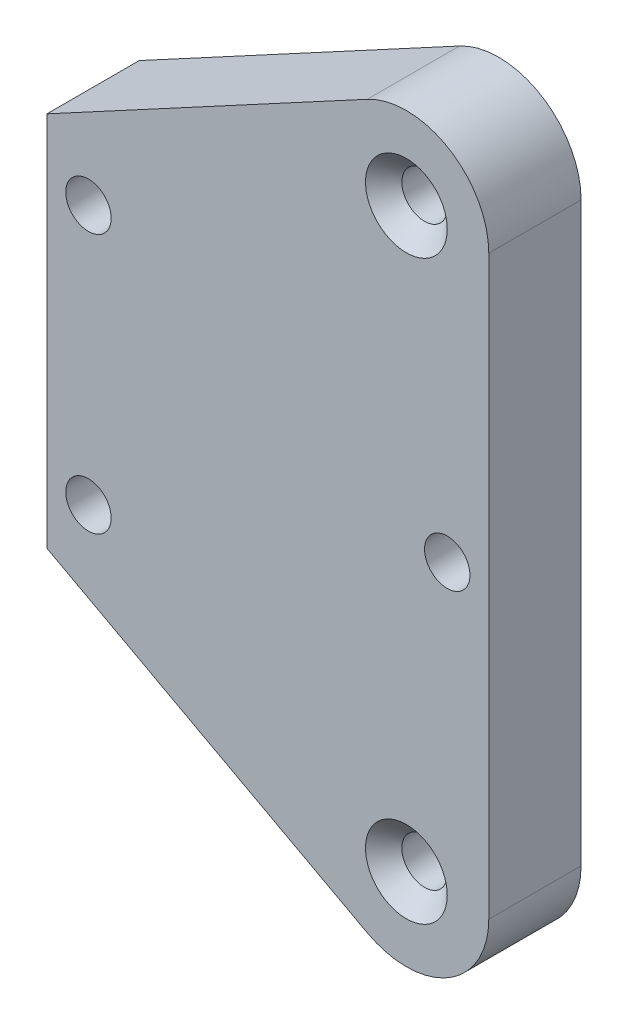
ISO-10303-21;
HEADER;
FILE_DESCRIPTION(('STEP AP214'),'2;1');
FILE_NAME('part.step','',(''),(''),'','','');
FILE_SCHEMA(('AUTOMOTIVE_DESIGN { 1 0 10303 214 1 1 1 1 }'));
ENDSEC;
DATA;
#1=APPLICATION_CONTEXT('core data for automotive mechanical design processes');
#2=APPLICATION_PROTOCOL_DEFINITION('international standard','automotive_design',2000,#1);
#3=PRODUCT_CONTEXT('',#1,'mechanical');
#4=PRODUCT('Part','Part','',(#3));
#5=PRODUCT_RELATED_PRODUCT_CATEGORY('part','',(#4));
#6=PRODUCT_DEFINITION_FORMATION('','',#4);
#7=PRODUCT_DEFINITION_CONTEXT('part definition',#1,'design');
#8=PRODUCT_DEFINITION('design','',#6,#7);
#9=PRODUCT_DEFINITION_SHAPE('','',#8);
#10=(LENGTH_UNIT() NAMED_UNIT(*) SI_UNIT(.MILLI.,.METRE.));
#11=(NAMED_UNIT(*) PLANE_ANGLE_UNIT() SI_UNIT($,.RADIAN.));
#12=(NAMED_UNIT(*) SI_UNIT($,.STERADIAN.) SOLID_ANGLE_UNIT());
#13=UNCERTAINTY_MEASURE_WITH_UNIT(LENGTH_MEASURE(1.E-05),#10,'distance_accuracy_value','');
#14=(GEOMETRIC_REPRESENTATION_CONTEXT(3) GLOBAL_UNCERTAINTY_ASSIGNED_CONTEXT((#13)) GLOBAL_UNIT_ASSIGNED_CONTEXT((#10,
#11,#12)) REPRESENTATION_CONTEXT('',''));
#15=CARTESIAN_POINT('',(0.,0.,0.));
#16=DIRECTION('',(0.,0.,1.));
#17=DIRECTION('',(1.,0.,0.));
#18=AXIS2_PLACEMENT_3D('',#15,#16,#17);
#19=CARTESIAN_POINT('',(0.,22.225,7.112));
#20=DIRECTION('',(0.,0.,-1.));
#21=DIRECTION('',(-1.,0.,0.));
#22=AXIS2_PLACEMENT_3D('',#19,#20,#21);
#23=PLANE('',#22);
#24=CARTESIAN_POINT('',(0.,22.225,7.112));
#25=DIRECTION('',(0.,0.,1.));
#26=DIRECTION('',(1.,0.,0.));
#27=AXIS2_PLACEMENT_3D('',#24,#25,#26);
#28=CIRCLE('',#27,3.15);
#29=CARTESIAN_POINT('',(3.15000000000001,22.225,7.112));
#30=VERTEX_POINT('',#29);
#31=EDGE_CURVE('E251',#30,#30,#28,.T.);
#32=ORIENTED_EDGE('',*,*,#31,.F.);
#33=EDGE_LOOP('',(#32));
#34=FACE_BOUND('',#33,.T.);
#35=CARTESIAN_POINT('',(3.15,0.,7.112));
#36=DIRECTION('',(0.,0.,1.));
#37=DIRECTION('',(1.,0.,0.));
#38=AXIS2_PLACEMENT_3D('',#35,#36,#37);
#39=CIRCLE('',#38,1.75);
#40=CARTESIAN_POINT('',(4.9,0.,7.112));
#41=VERTEX_POINT('',#40);
#42=EDGE_CURVE('E139',#41,#41,#39,.T.);
#43=ORIENTED_EDGE('',*,*,#42,.F.);
#44=EDGE_LOOP('',(#43));
#45=FACE_BOUND('',#44,.T.);
#46=CARTESIAN_POINT('',(-24.5,-10.,7.112));
#47=DIRECTION('',(0.,0.,1.));
#48=DIRECTION('',(1.,0.,0.));
#49=AXIS2_PLACEMENT_3D('',#46,#47,#48);
#50=CIRCLE('',#49,1.75);
#51=CARTESIAN_POINT('',(-22.75,-10.,7.112));
#52=VERTEX_POINT('',#51);
#53=EDGE_CURVE('E165',#52,#52,#50,.T.);
#54=ORIENTED_EDGE('',*,*,#53,.F.);
#55=EDGE_LOOP('',(#54));
#56=FACE_BOUND('',#55,.T.);
#57=CARTESIAN_POINT('',(-24.5,9.99999999999999,7.112));
#58=DIRECTION('',(0.,0.,1.));
#59=DIRECTION('',(1.,0.,0.));
#60=AXIS2_PLACEMENT_3D('',#57,#58,#59);
#61=CIRCLE('',#60,1.75);
#62=CARTESIAN_POINT('',(-22.75,9.99999999999999,7.112));
#63=VERTEX_POINT('',#62);
#64=EDGE_CURVE('E168',#63,#63,#61,.T.);
#65=ORIENTED_EDGE('',*,*,#64,.F.);
#66=EDGE_LOOP('',(#65));
#67=FACE_BOUND('',#66,.T.);
#68=DIRECTION('',(-0.880148498110485,-0.474698452992906,0.));
#69=VECTOR('',#68,1.);
#70=CARTESIAN_POINT('',(-27.7,14.5,7.112));
#71=LINE('',#70,#69);
#72=CARTESIAN_POINT('',(-3.01433517650495,27.8139429630016,7.112));
#73=VERTEX_POINT('',#72);
#74=CARTESIAN_POINT('',(-27.7,14.5,7.112));
#75=VERTEX_POINT('',#74);
#76=EDGE_CURVE('E131',#73,#75,#71,.T.);
#77=ORIENTED_EDGE('',*,*,#76,.T.);
#78=DIRECTION('',(0.,-1.,0.));
#79=VECTOR('',#78,1.);
#80=CARTESIAN_POINT('',(-27.7,14.5,7.112));
#81=LINE('',#80,#79);
#82=CARTESIAN_POINT('',(-27.7,-14.5,7.112));
#83=VERTEX_POINT('',#82);
#84=EDGE_CURVE('E89',#75,#83,#81,.T.);
#85=ORIENTED_EDGE('',*,*,#84,.T.);
#86=DIRECTION('',(0.880148498110485,-0.474698452992906,0.));
#87=VECTOR('',#86,1.);
#88=CARTESIAN_POINT('',(-27.7,-14.5,7.112));
#89=LINE('',#88,#87);
#90=CARTESIAN_POINT('',(-3.01433517650494,-27.8139429630016,7.112));
#91=VERTEX_POINT('',#90);
#92=EDGE_CURVE('E102',#83,#91,#89,.T.);
#93=ORIENTED_EDGE('',*,*,#92,.T.);
#94=CARTESIAN_POINT('',(0.,-22.225,7.112));
#95=DIRECTION('',(0.,0.,1.));
#96=DIRECTION('',(1.,0.,0.));
#97=AXIS2_PLACEMENT_3D('',#94,#95,#96);
#98=CIRCLE('',#97,6.35);
#99=CARTESIAN_POINT('',(6.35000000000001,-22.225,7.112));
#100=VERTEX_POINT('',#99);
#101=EDGE_CURVE('E96',#91,#100,#98,.T.);
#102=ORIENTED_EDGE('',*,*,#101,.T.);
#103=DIRECTION('',(0.,1.,0.));
#104=VECTOR('',#103,1.);
#105=CARTESIAN_POINT('',(6.35,22.225,7.112));
#106=LINE('',#105,#104);
#107=CARTESIAN_POINT('',(6.35,22.225,7.112));
#108=VERTEX_POINT('',#107);
#109=EDGE_CURVE('E100',#100,#108,#106,.T.);
#110=ORIENTED_EDGE('',*,*,#109,.T.);
#111=CARTESIAN_POINT('',(0.,22.225,7.112));
#112=DIRECTION('',(0.,0.,1.));
#113=DIRECTION('',(-1.,0.,0.));
#114=AXIS2_PLACEMENT_3D('',#111,#112,#113);
#115=CIRCLE('',#114,6.35);
#116=EDGE_CURVE('E52',#108,#73,#115,.T.);
#117=ORIENTED_EDGE('',*,*,#116,.T.);
#118=EDGE_LOOP('',(#77,#85,#93,#102,#110,#117));
#119=FACE_BOUND('',#118,.T.);
#120=CARTESIAN_POINT('',(0.,-22.225,7.112));
#121=DIRECTION('',(0.,0.,1.));
#122=DIRECTION('',(1.,0.,0.));
#123=AXIS2_PLACEMENT_3D('',#120,#121,#122);
#124=CIRCLE('',#123,3.15);
#125=CARTESIAN_POINT('',(3.15000000000001,-22.225,7.112));
#126=VERTEX_POINT('',#125);
#127=EDGE_CURVE('E155',#126,#126,#124,.T.);
#128=ORIENTED_EDGE('',*,*,#127,.F.);
#129=EDGE_LOOP('',(#128));
#130=FACE_BOUND('',#129,.T.);
#131=ADVANCED_FACE('F33',(#34,#45,#56,#67,#119,#130),#23,.F.);
#132=CARTESIAN_POINT('',(0.,22.225,0.));
#133=DIRECTION('',(0.,0.,-1.));
#134=DIRECTION('',(-1.,0.,0.));
#135=AXIS2_PLACEMENT_3D('',#132,#133,#134);
#136=PLANE('',#135);
#137=CARTESIAN_POINT('',(3.15,0.,0.));
#138=DIRECTION('',(0.,0.,-1.));
#139=DIRECTION('',(-1.,0.,0.));
#140=AXIS2_PLACEMENT_3D('',#137,#138,#139);
#141=CIRCLE('',#140,3.15);
#142=CARTESIAN_POINT('',(0.,0.,0.));
#143=VERTEX_POINT('',#142);
#144=EDGE_CURVE('E144',#143,#143,#141,.T.);
#145=ORIENTED_EDGE('',*,*,#144,.F.);
#146=EDGE_LOOP('',(#145));
#147=FACE_BOUND('',#146,.T.);
#148=CARTESIAN_POINT('',(-24.5,9.99999999999999,0.));
#149=DIRECTION('',(0.,0.,-1.));
#150=DIRECTION('',(-1.,0.,0.));
#151=AXIS2_PLACEMENT_3D('',#148,#149,#150);
#152=CIRCLE('',#151,3.15);
#153=CARTESIAN_POINT('',(-27.65,9.99999999999999,0.));
#154=VERTEX_POINT('',#153);
#155=EDGE_CURVE('E143',#154,#154,#152,.T.);
#156=ORIENTED_EDGE('',*,*,#155,.F.);
#157=EDGE_LOOP('',(#156));
#158=FACE_BOUND('',#157,.T.);
#159=CARTESIAN_POINT('',(-24.5,-10.,0.));
#160=DIRECTION('',(0.,0.,-1.));
#161=DIRECTION('',(-1.,0.,0.));
#162=AXIS2_PLACEMENT_3D('',#159,#160,#161);
#163=CIRCLE('',#162,3.15);
#164=CARTESIAN_POINT('',(-27.65,-10.,0.));
#165=VERTEX_POINT('',#164);
#166=EDGE_CURVE('E140',#165,#165,#163,.T.);
#167=ORIENTED_EDGE('',*,*,#166,.F.);
#168=EDGE_LOOP('',(#167));
#169=FACE_BOUND('',#168,.T.);
#170=CARTESIAN_POINT('',(0.,22.225,0.));
#171=DIRECTION('',(0.,0.,1.));
#172=DIRECTION('',(1.,0.,0.));
#173=AXIS2_PLACEMENT_3D('',#170,#171,#172);
#174=CIRCLE('',#173,1.75);
#175=CARTESIAN_POINT('',(1.75000000000001,22.225,0.));
#176=VERTEX_POINT('',#175);
#177=EDGE_CURVE('E171',#176,#176,#174,.T.);
#178=ORIENTED_EDGE('',*,*,#177,.T.);
#179=EDGE_LOOP('',(#178));
#180=FACE_BOUND('',#179,.T.);
#181=DIRECTION('',(-0.880148498110485,-0.474698452992906,0.));
#182=VECTOR('',#181,1.);
#183=CARTESIAN_POINT('',(-27.7,14.5,0.));
#184=LINE('',#183,#182);
#185=CARTESIAN_POINT('',(-3.01433517650495,27.8139429630016,0.));
#186=VERTEX_POINT('',#185);
#187=CARTESIAN_POINT('',(-27.7,14.5,0.));
#188=VERTEX_POINT('',#187);
#189=EDGE_CURVE('E120',#186,#188,#184,.T.);
#190=ORIENTED_EDGE('',*,*,#189,.F.);
#191=CARTESIAN_POINT('',(0.,22.225,0.));
#192=DIRECTION('',(0.,0.,1.));
#193=DIRECTION('',(-1.,0.,0.));
#194=AXIS2_PLACEMENT_3D('',#191,#192,#193);
#195=CIRCLE('',#194,6.35);
#196=CARTESIAN_POINT('',(6.35,22.225,0.));
#197=VERTEX_POINT('',#196);
#198=EDGE_CURVE('E81',#197,#186,#195,.T.);
#199=ORIENTED_EDGE('',*,*,#198,.F.);
#200=DIRECTION('',(0.,1.,0.));
#201=VECTOR('',#200,1.);
#202=CARTESIAN_POINT('',(6.35,22.225,0.));
#203=LINE('',#202,#201);
#204=CARTESIAN_POINT('',(6.35000000000001,-22.225,0.));
#205=VERTEX_POINT('',#204);
#206=EDGE_CURVE('E75',#205,#197,#203,.T.);
#207=ORIENTED_EDGE('',*,*,#206,.F.);
#208=CARTESIAN_POINT('',(0.,-22.225,0.));
#209=DIRECTION('',(0.,0.,1.));
#210=DIRECTION('',(1.,0.,0.));
#211=AXIS2_PLACEMENT_3D('',#208,#209,#210);
#212=CIRCLE('',#211,6.35);
#213=CARTESIAN_POINT('',(-3.01433517650494,-27.8139429630016,0.));
#214=VERTEX_POINT('',#213);
#215=EDGE_CURVE('E110',#214,#205,#212,.T.);
#216=ORIENTED_EDGE('',*,*,#215,.F.);
#217=DIRECTION('',(0.880148498110485,-0.474698452992906,0.));
#218=VECTOR('',#217,1.);
#219=CARTESIAN_POINT('',(-27.7,-14.5,0.));
#220=LINE('',#219,#218);
#221=CARTESIAN_POINT('',(-27.7,-14.5,0.));
#222=VERTEX_POINT('',#221);
#223=EDGE_CURVE('E126',#222,#214,#220,.T.);
#224=ORIENTED_EDGE('',*,*,#223,.F.);
#225=DIRECTION('',(0.,-1.,0.));
#226=VECTOR('',#225,1.);
#227=CARTESIAN_POINT('',(-27.7,14.5,0.));
#228=LINE('',#227,#226);
#229=EDGE_CURVE('E123',#188,#222,#228,.T.);
#230=ORIENTED_EDGE('',*,*,#229,.F.);
#231=EDGE_LOOP('',(#190,#199,#207,#216,#224,#230));
#232=FACE_BOUND('',#231,.T.);
#233=CARTESIAN_POINT('',(0.,-22.225,0.));
#234=DIRECTION('',(0.,0.,1.));
#235=DIRECTION('',(1.,0.,0.));
#236=AXIS2_PLACEMENT_3D('',#233,#234,#235);
#237=CIRCLE('',#236,1.75);
#238=CARTESIAN_POINT('',(1.75000000000001,-22.225,0.));
#239=VERTEX_POINT('',#238);
#240=EDGE_CURVE('E124',#239,#239,#237,.T.);
#241=ORIENTED_EDGE('',*,*,#240,.T.);
#242=EDGE_LOOP('',(#241));
#243=FACE_BOUND('',#242,.T.);
#244=ADVANCED_FACE('F185',(#147,#158,#169,#180,#232,#243),#136,.T.);
#245=CARTESIAN_POINT('',(-27.7,14.5,7.112));
#246=DIRECTION('',(0.474698452992906,-0.880148498110485,0.));
#247=DIRECTION('',(0.880148498110485,0.474698452992906,0.));
#248=AXIS2_PLACEMENT_3D('',#245,#246,#247);
#249=PLANE('',#248);
#250=ORIENTED_EDGE('',*,*,#189,.T.);
#251=DIRECTION('',(0.,0.,-1.));
#252=VECTOR('',#251,1.);
#253=CARTESIAN_POINT('',(-27.7,14.5,7.112));
#254=LINE('',#253,#252);
#255=EDGE_CURVE('E11',#75,#188,#254,.T.);
#256=ORIENTED_EDGE('',*,*,#255,.F.);
#257=ORIENTED_EDGE('',*,*,#76,.F.);
#258=DIRECTION('',(0.,0.,-1.));
#259=VECTOR('',#258,1.);
#260=CARTESIAN_POINT('',(-3.01433517650495,27.8139429630016,7.112));
#261=LINE('',#260,#259);
#262=EDGE_CURVE('E116',#73,#186,#261,.T.);
#263=ORIENTED_EDGE('',*,*,#262,.T.);
#264=EDGE_LOOP('',(#250,#256,#257,#263));
#265=FACE_BOUND('',#264,.T.);
#266=ADVANCED_FACE('F35',(#265),#249,.F.);
#267=CARTESIAN_POINT('',(-27.7,14.5,7.112));
#268=DIRECTION('',(1.,0.,0.));
#269=DIRECTION('',(0.,0.,-1.));
#270=AXIS2_PLACEMENT_3D('',#267,#268,#269);
#271=PLANE('',#270);
#272=ORIENTED_EDGE('',*,*,#229,.T.);
#273=DIRECTION('',(0.,0.,-1.));
#274=VECTOR('',#273,1.);
#275=CARTESIAN_POINT('',(-27.7,-14.5,7.112));
#276=LINE('',#275,#274);
#277=EDGE_CURVE('E43',#83,#222,#276,.T.);
#278=ORIENTED_EDGE('',*,*,#277,.F.);
#279=ORIENTED_EDGE('',*,*,#84,.F.);
#280=ORIENTED_EDGE('',*,*,#255,.T.);
#281=EDGE_LOOP('',(#272,#278,#279,#280));
#282=FACE_BOUND('',#281,.T.);
#283=ADVANCED_FACE('F179',(#282),#271,.F.);
#284=CARTESIAN_POINT('',(-27.7,-14.5,7.112));
#285=DIRECTION('',(0.474698452992906,0.880148498110485,0.));
#286=DIRECTION('',(-0.880148498110485,0.474698452992906,0.));
#287=AXIS2_PLACEMENT_3D('',#284,#285,#286);
#288=PLANE('',#287);
#289=ORIENTED_EDGE('',*,*,#223,.T.);
#290=DIRECTION('',(0.,0.,-1.));
#291=VECTOR('',#290,1.);
#292=CARTESIAN_POINT('',(-3.01433517650494,-27.8139429630016,7.112));
#293=LINE('',#292,#291);
#294=EDGE_CURVE('E111',#91,#214,#293,.T.);
#295=ORIENTED_EDGE('',*,*,#294,.F.);
#296=ORIENTED_EDGE('',*,*,#92,.F.);
#297=ORIENTED_EDGE('',*,*,#277,.T.);
#298=EDGE_LOOP('',(#289,#295,#296,#297));
#299=FACE_BOUND('',#298,.T.);
#300=ADVANCED_FACE('F182',(#299),#288,.F.);
#301=CARTESIAN_POINT('',(0.,-22.225,7.112));
#302=DIRECTION('',(0.,0.,-1.));
#303=DIRECTION('',(-1.,0.,0.));
#304=AXIS2_PLACEMENT_3D('',#301,#302,#303);
#305=CYLINDRICAL_SURFACE('',#304,6.35);
#306=ORIENTED_EDGE('',*,*,#215,.T.);
#307=DIRECTION('',(0.,0.,-1.));
#308=VECTOR('',#307,1.);
#309=CARTESIAN_POINT('',(6.35000000000001,-22.225,7.112));
#310=LINE('',#309,#308);
#311=EDGE_CURVE('E107',#100,#205,#310,.T.);
#312=ORIENTED_EDGE('',*,*,#311,.F.);
#313=ORIENTED_EDGE('',*,*,#101,.F.);
#314=ORIENTED_EDGE('',*,*,#294,.T.);
#315=EDGE_LOOP('',(#306,#312,#313,#314));
#316=FACE_BOUND('',#315,.T.);
#317=ADVANCED_FACE('F108',(#316),#305,.T.);
#318=CARTESIAN_POINT('',(6.35,22.225,7.112));
#319=DIRECTION('',(-1.,0.,0.));
#320=DIRECTION('',(0.,0.,1.));
#321=AXIS2_PLACEMENT_3D('',#318,#319,#320);
#322=PLANE('',#321);
#323=ORIENTED_EDGE('',*,*,#206,.T.);
#324=DIRECTION('',(0.,0.,-1.));
#325=VECTOR('',#324,1.);
#326=CARTESIAN_POINT('',(6.35,22.225,7.112));
#327=LINE('',#326,#325);
#328=EDGE_CURVE('E112',#108,#197,#327,.T.);
#329=ORIENTED_EDGE('',*,*,#328,.F.);
#330=ORIENTED_EDGE('',*,*,#109,.F.);
#331=ORIENTED_EDGE('',*,*,#311,.T.);
#332=EDGE_LOOP('',(#323,#329,#330,#331));
#333=FACE_BOUND('',#332,.T.);
#334=ADVANCED_FACE('F114',(#333),#322,.F.);
#335=CARTESIAN_POINT('',(0.,22.225,7.112));
#336=DIRECTION('',(0.,0.,-1.));
#337=DIRECTION('',(-1.,0.,0.));
#338=AXIS2_PLACEMENT_3D('',#335,#336,#337);
#339=CYLINDRICAL_SURFACE('',#338,6.35);
#340=ORIENTED_EDGE('',*,*,#198,.T.);
#341=ORIENTED_EDGE('',*,*,#262,.F.);
#342=ORIENTED_EDGE('',*,*,#116,.F.);
#343=ORIENTED_EDGE('',*,*,#328,.T.);
#344=EDGE_LOOP('',(#340,#341,#342,#343));
#345=FACE_BOUND('',#344,.T.);
#346=ADVANCED_FACE('F188',(#345),#339,.T.);
#347=CARTESIAN_POINT('',(0.,-22.225,7.112));
#348=DIRECTION('',(0.,0.,-1.));
#349=DIRECTION('',(-1.,0.,0.));
#350=AXIS2_PLACEMENT_3D('',#347,#348,#349);
#351=CYLINDRICAL_SURFACE('',#350,1.75);
#352=CARTESIAN_POINT('',(0.,-22.225,5.71200000000002));
#353=DIRECTION('',(0.,0.,1.));
#354=DIRECTION('',(1.,0.,0.));
#355=AXIS2_PLACEMENT_3D('',#352,#353,#354);
#356=CIRCLE('',#355,1.75);
#357=CARTESIAN_POINT('',(1.75000000000001,-22.225,5.71200000000002));
#358=VERTEX_POINT('',#357);
#359=EDGE_CURVE('E37',#358,#358,#356,.F.);
#360=ORIENTED_EDGE('',*,*,#359,.F.);
#361=EDGE_LOOP('',(#360));
#362=FACE_BOUND('',#361,.T.);
#363=ORIENTED_EDGE('',*,*,#240,.F.);
#364=EDGE_LOOP('',(#363));
#365=FACE_BOUND('',#364,.T.);
#366=ADVANCED_FACE('F190',(#362,#365),#351,.F.);
#367=CARTESIAN_POINT('',(0.,22.225,7.112));
#368=DIRECTION('',(0.,0.,-1.));
#369=DIRECTION('',(-1.,0.,0.));
#370=AXIS2_PLACEMENT_3D('',#367,#368,#369);
#371=CYLINDRICAL_SURFACE('',#370,1.75);
#372=CARTESIAN_POINT('',(0.,22.225,5.71200000000002));
#373=DIRECTION('',(0.,0.,1.));
#374=DIRECTION('',(1.,0.,0.));
#375=AXIS2_PLACEMENT_3D('',#372,#373,#374);
#376=CIRCLE('',#375,1.75);
#377=CARTESIAN_POINT('',(1.75000000000001,22.225,5.71200000000002));
#378=VERTEX_POINT('',#377);
#379=EDGE_CURVE('E249',#378,#378,#376,.F.);
#380=ORIENTED_EDGE('',*,*,#379,.F.);
#381=EDGE_LOOP('',(#380));
#382=FACE_BOUND('',#381,.T.);
#383=ORIENTED_EDGE('',*,*,#177,.F.);
#384=EDGE_LOOP('',(#383));
#385=FACE_BOUND('',#384,.T.);
#386=ADVANCED_FACE('F196',(#382,#385),#371,.F.);
#387=CARTESIAN_POINT('',(-24.5,9.99999999999999,7.112));
#388=DIRECTION('',(0.,0.,-1.));
#389=DIRECTION('',(-1.,0.,0.));
#390=AXIS2_PLACEMENT_3D('',#387,#388,#389);
#391=CYLINDRICAL_SURFACE('',#390,1.75);
#392=CARTESIAN_POINT('',(-24.5,9.99999999999999,1.4));
#393=DIRECTION('',(0.,0.,-1.));
#394=DIRECTION('',(-1.,0.,0.));
#395=AXIS2_PLACEMENT_3D('',#392,#393,#394);
#396=CIRCLE('',#395,1.75);
#397=CARTESIAN_POINT('',(-26.25,9.99999999999999,1.4));
#398=VERTEX_POINT('',#397);
#399=EDGE_CURVE('E148',#398,#398,#396,.F.);
#400=ORIENTED_EDGE('',*,*,#399,.F.);
#401=EDGE_LOOP('',(#400));
#402=FACE_BOUND('',#401,.T.);
#403=ORIENTED_EDGE('',*,*,#64,.T.);
#404=EDGE_LOOP('',(#403));
#405=FACE_BOUND('',#404,.T.);
#406=ADVANCED_FACE('F213',(#402,#405),#391,.F.);
#407=CARTESIAN_POINT('',(-24.5,-10.,7.112));
#408=DIRECTION('',(0.,0.,-1.));
#409=DIRECTION('',(-1.,0.,0.));
#410=AXIS2_PLACEMENT_3D('',#407,#408,#409);
#411=CYLINDRICAL_SURFACE('',#410,1.75);
#412=CARTESIAN_POINT('',(-24.5,-10.,1.4));
#413=DIRECTION('',(0.,0.,-1.));
#414=DIRECTION('',(-1.,0.,0.));
#415=AXIS2_PLACEMENT_3D('',#412,#413,#414);
#416=CIRCLE('',#415,1.75);
#417=CARTESIAN_POINT('',(-26.25,-10.,1.4));
#418=VERTEX_POINT('',#417);
#419=EDGE_CURVE('E137',#418,#418,#416,.F.);
#420=ORIENTED_EDGE('',*,*,#419,.F.);
#421=EDGE_LOOP('',(#420));
#422=FACE_BOUND('',#421,.T.);
#423=ORIENTED_EDGE('',*,*,#53,.T.);
#424=EDGE_LOOP('',(#423));
#425=FACE_BOUND('',#424,.T.);
#426=ADVANCED_FACE('F217',(#422,#425),#411,.F.);
#427=CARTESIAN_POINT('',(3.15,0.,7.112));
#428=DIRECTION('',(0.,0.,-1.));
#429=DIRECTION('',(-1.,0.,0.));
#430=AXIS2_PLACEMENT_3D('',#427,#428,#429);
#431=CYLINDRICAL_SURFACE('',#430,1.75);
#432=CARTESIAN_POINT('',(3.15,0.,1.39999999999998));
#433=DIRECTION('',(0.,0.,-1.));
#434=DIRECTION('',(-1.,0.,0.));
#435=AXIS2_PLACEMENT_3D('',#432,#433,#434);
#436=CIRCLE('',#435,1.75);
#437=CARTESIAN_POINT('',(1.4,0.,1.39999999999998));
#438=VERTEX_POINT('',#437);
#439=EDGE_CURVE('E141',#438,#438,#436,.F.);
#440=ORIENTED_EDGE('',*,*,#439,.F.);
#441=EDGE_LOOP('',(#440));
#442=FACE_BOUND('',#441,.T.);
#443=ORIENTED_EDGE('',*,*,#42,.T.);
#444=EDGE_LOOP('',(#443));
#445=FACE_BOUND('',#444,.T.);
#446=ADVANCED_FACE('F221',(#442,#445),#431,.F.);
#447=CARTESIAN_POINT('',(-24.5,-10.,0.));
#448=DIRECTION('',(0.,0.,-1.));
#449=DIRECTION('',(-1.,0.,0.));
#450=AXIS2_PLACEMENT_3D('',#447,#448,#449);
#451=CONICAL_SURFACE('',#450,3.15,0.785398163397448);
#452=ORIENTED_EDGE('',*,*,#419,.T.);
#453=EDGE_LOOP('',(#452));
#454=FACE_BOUND('',#453,.T.);
#455=ORIENTED_EDGE('',*,*,#166,.T.);
#456=EDGE_LOOP('',(#455));
#457=FACE_BOUND('',#456,.T.);
#458=ADVANCED_FACE('F225',(#454,#457),#451,.F.);
#459=CARTESIAN_POINT('',(-24.5,9.99999999999999,0.));
#460=DIRECTION('',(0.,0.,-1.));
#461=DIRECTION('',(-1.,0.,0.));
#462=AXIS2_PLACEMENT_3D('',#459,#460,#461);
#463=CONICAL_SURFACE('',#462,3.15,0.785398163397448);
#464=ORIENTED_EDGE('',*,*,#399,.T.);
#465=EDGE_LOOP('',(#464));
#466=FACE_BOUND('',#465,.T.);
#467=ORIENTED_EDGE('',*,*,#155,.T.);
#468=EDGE_LOOP('',(#467));
#469=FACE_BOUND('',#468,.T.);
#470=ADVANCED_FACE('F229',(#466,#469),#463,.F.);
#471=CARTESIAN_POINT('',(3.15,0.,0.));
#472=DIRECTION('',(0.,0.,-1.));
#473=DIRECTION('',(-1.,0.,0.));
#474=AXIS2_PLACEMENT_3D('',#471,#472,#473);
#475=CONICAL_SURFACE('',#474,3.15,0.785398163397453);
#476=ORIENTED_EDGE('',*,*,#439,.T.);
#477=EDGE_LOOP('',(#476));
#478=FACE_BOUND('',#477,.T.);
#479=ORIENTED_EDGE('',*,*,#144,.T.);
#480=EDGE_LOOP('',(#479));
#481=FACE_BOUND('',#480,.T.);
#482=ADVANCED_FACE('F233',(#478,#481),#475,.F.);
#483=CARTESIAN_POINT('',(0.,-22.225,7.112));
#484=DIRECTION('',(0.,0.,1.));
#485=DIRECTION('',(1.,0.,0.));
#486=AXIS2_PLACEMENT_3D('',#483,#484,#485);
#487=CONICAL_SURFACE('',#486,3.15,0.785398163397453);
#488=ORIENTED_EDGE('',*,*,#359,.T.);
#489=EDGE_LOOP('',(#488));
#490=FACE_BOUND('',#489,.T.);
#491=ORIENTED_EDGE('',*,*,#127,.T.);
#492=EDGE_LOOP('',(#491));
#493=FACE_BOUND('',#492,.T.);
#494=ADVANCED_FACE('F237',(#490,#493),#487,.F.);
#495=CARTESIAN_POINT('',(0.,22.225,7.112));
#496=DIRECTION('',(0.,0.,1.));
#497=DIRECTION('',(1.,0.,0.));
#498=AXIS2_PLACEMENT_3D('',#495,#496,#497);
#499=CONICAL_SURFACE('',#498,3.15,0.785398163397453);
#500=ORIENTED_EDGE('',*,*,#379,.T.);
#501=EDGE_LOOP('',(#500));
#502=FACE_BOUND('',#501,.T.);
#503=ORIENTED_EDGE('',*,*,#31,.T.);
#504=EDGE_LOOP('',(#503));
#505=FACE_BOUND('',#504,.T.);
#506=ADVANCED_FACE('F240',(#502,#505),#499,.F.);
#507=CLOSED_SHELL('',(#131,#244,#266,#283,#300,#317,#334,#346,#366,#386,#406,#426,#446,#458,
#470,#482,#494,#506));
#508=MANIFOLD_SOLID_BREP('B2',#507);
#509=ADVANCED_BREP_SHAPE_REPRESENTATION('',(#18,#508),#14);
#510=SHAPE_DEFINITION_REPRESENTATION(#9,#509);
ENDSEC;
END-ISO-10303-21;
